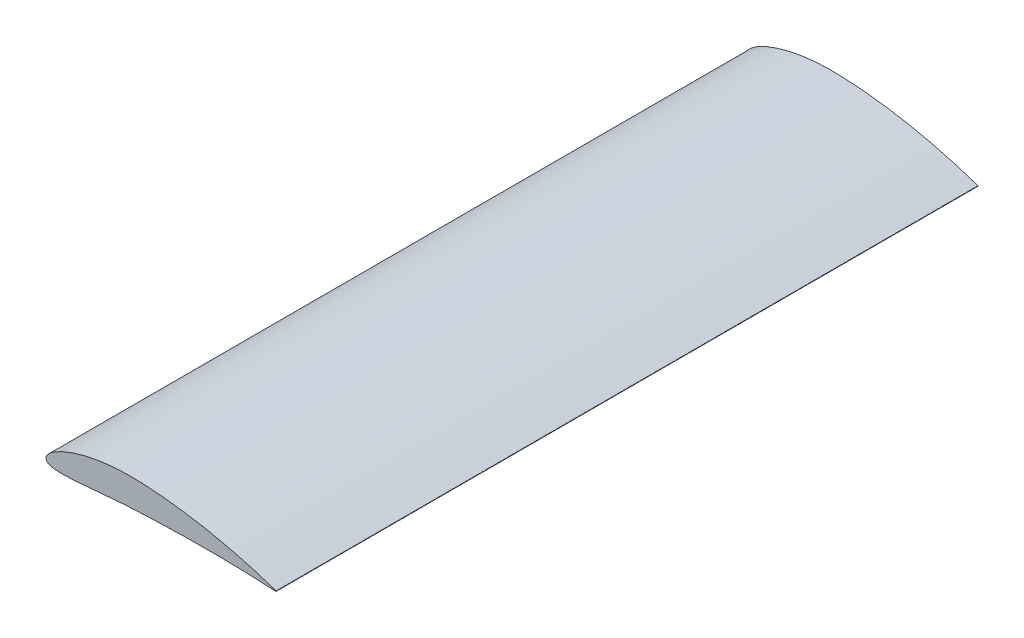
ISO-10303-21;
HEADER;
FILE_DESCRIPTION(('STEP AP214'),'2;1');
FILE_NAME('part.step','',(''),(''),'','','');
FILE_SCHEMA(('AUTOMOTIVE_DESIGN { 1 0 10303 214 1 1 1 1 }'));
ENDSEC;
DATA;
#1=APPLICATION_CONTEXT('core data for automotive mechanical design processes');
#2=APPLICATION_PROTOCOL_DEFINITION('international standard','automotive_design',2000,#1);
#3=PRODUCT_CONTEXT('',#1,'mechanical');
#4=PRODUCT('Part','Part','',(#3));
#5=PRODUCT_RELATED_PRODUCT_CATEGORY('part','',(#4));
#6=PRODUCT_DEFINITION_FORMATION('','',#4);
#7=PRODUCT_DEFINITION_CONTEXT('part definition',#1,'design');
#8=PRODUCT_DEFINITION('design','',#6,#7);
#9=PRODUCT_DEFINITION_SHAPE('','',#8);
#10=(LENGTH_UNIT() NAMED_UNIT(*) SI_UNIT(.MILLI.,.METRE.));
#11=(NAMED_UNIT(*) PLANE_ANGLE_UNIT() SI_UNIT($,.RADIAN.));
#12=(NAMED_UNIT(*) SI_UNIT($,.STERADIAN.) SOLID_ANGLE_UNIT());
#13=UNCERTAINTY_MEASURE_WITH_UNIT(LENGTH_MEASURE(1.E-05),#10,'distance_accuracy_value','');
#14=(GEOMETRIC_REPRESENTATION_CONTEXT(3) GLOBAL_UNCERTAINTY_ASSIGNED_CONTEXT((#13)) GLOBAL_UNIT_ASSIGNED_CONTEXT((#10,
#11,#12)) REPRESENTATION_CONTEXT('',''));
#15=CARTESIAN_POINT('',(0.,0.,0.));
#16=DIRECTION('',(0.,0.,1.));
#17=DIRECTION('',(1.,0.,0.));
#18=AXIS2_PLACEMENT_3D('',#15,#16,#17);
#19=CARTESIAN_POINT('',(400.,-56.1314604241552,610.));
#20=CARTESIAN_POINT('',(399.643918554306,-56.0100243892497,610.));
#21=CARTESIAN_POINT('',(398.225182446609,-55.5261865213148,610.));
#22=CARTESIAN_POINT('',(395.049408188706,-54.4412610846626,610.));
#23=CARTESIAN_POINT('',(389.783373865849,-52.6912902877293,610.));
#24=CARTESIAN_POINT('',(382.482718122838,-50.3092467823389,610.));
#25=CARTESIAN_POINT('',(373.20995949318,-47.3935870218292,610.));
#26=CARTESIAN_POINT('',(362.051946032247,-44.0358579057166,610.));
#27=CARTESIAN_POINT('',(349.118444869533,-40.3420425178444,610.));
#28=CARTESIAN_POINT('',(334.534016291896,-36.4292739847207,610.));
#29=CARTESIAN_POINT('',(318.445847384667,-32.4164875997235,610.));
#30=CARTESIAN_POINT('',(301.015870800138,-28.4316418465155,610.));
#31=CARTESIAN_POINT('',(282.430745597752,-24.5755442737041,610.));
#32=CARTESIAN_POINT('',(262.884756985944,-20.974334447521,610.));
#33=CARTESIAN_POINT('',(242.588909845362,-17.7350749285767,610.));
#34=CARTESIAN_POINT('',(221.766202388904,-14.9428293601724,610.));
#35=CARTESIAN_POINT('',(200.650785270376,-12.6886104485751,610.));
#36=CARTESIAN_POINT('',(179.469337758746,-11.0453447980687,610.));
#37=CARTESIAN_POINT('',(158.317419739384,-9.98879058200502,610.));
#38=CARTESIAN_POINT('',(137.422408652381,-9.92184078297386,610.));
#39=CARTESIAN_POINT('',(117.076822685352,-11.0062063522153,610.));
#40=CARTESIAN_POINT('',(97.7025756672614,-13.1385462010802,610.));
#41=CARTESIAN_POINT('',(79.5556671647519,-16.1957676331034,610.));
#42=CARTESIAN_POINT('',(62.8746232660483,-20.0461771052577,610.));
#43=CARTESIAN_POINT('',(47.8680976505703,-24.5036769361908,610.));
#44=CARTESIAN_POINT('',(34.7110447114062,-29.3700191903889,610.));
#45=CARTESIAN_POINT('',(23.544592010873,-34.4495343526392,610.));
#46=CARTESIAN_POINT('',(14.4740243328016,-39.5475050094727,610.));
#47=CARTESIAN_POINT('',(7.53911833084606,-44.484654540248,610.));
#48=CARTESIAN_POINT('',(2.77679390332445,-49.1540044189054,610.));
#49=CARTESIAN_POINT('',(0.0408785011586782,-53.5706365267323,610.));
#50=CARTESIAN_POINT('',(-0.194546817230398,-58.0079682198484,610.));
#51=CARTESIAN_POINT('',(2.44644908341802,-61.5541278861037,610.));
#52=CARTESIAN_POINT('',(7.06381671583535,-63.7654491289412,610.));
#53=CARTESIAN_POINT('',(13.4070985066364,-65.2069326628135,610.));
#54=CARTESIAN_POINT('',(21.5759533686981,-65.9473712076171,610.));
#55=CARTESIAN_POINT('',(31.4892585318981,-66.0697876651186,610.));
#56=CARTESIAN_POINT('',(43.0523238718758,-65.6389057265911,610.));
#57=CARTESIAN_POINT('',(56.1353015930865,-64.752489091053,610.));
#58=CARTESIAN_POINT('',(70.6041221469098,-63.5109889914793,610.));
#59=CARTESIAN_POINT('',(86.3184796834182,-62.0516048768765,610.));
#60=CARTESIAN_POINT('',(103.137102564271,-60.4953584349966,610.));
#61=CARTESIAN_POINT('',(120.914651969131,-58.9730905561407,610.));
#62=CARTESIAN_POINT('',(139.503910061892,-57.6216080664032,610.));
#63=CARTESIAN_POINT('',(158.899188374292,-56.5863970162045,610.));
#64=CARTESIAN_POINT('',(178.927680161598,-55.8354475247872,610.));
#65=CARTESIAN_POINT('',(199.378638327157,-55.0618803532254,610.));
#66=CARTESIAN_POINT('',(219.896731539223,-54.4308870331711,610.));
#67=CARTESIAN_POINT('',(240.253059313818,-53.9568109236802,610.));
#68=CARTESIAN_POINT('',(260.230575419891,-53.6642218198919,610.));
#69=CARTESIAN_POINT('',(279.609294350998,-53.5626974689925,610.));
#70=CARTESIAN_POINT('',(298.173165924277,-53.6409117870195,610.));
#71=CARTESIAN_POINT('',(315.712834064661,-53.8685717056236,610.));
#72=CARTESIAN_POINT('',(332.02597831082,-54.2376998087038,610.));
#73=CARTESIAN_POINT('',(346.921244916658,-54.6756757557696,610.));
#74=CARTESIAN_POINT('',(360.228403072193,-55.1751582104505,610.));
#75=CARTESIAN_POINT('',(371.761412466439,-55.6544442495398,610.));
#76=CARTESIAN_POINT('',(381.458692990959,-56.170812242102,610.));
#77=CARTESIAN_POINT('',(388.980801900753,-56.4119994138752,610.));
#78=CARTESIAN_POINT('',(394.775205353922,-57.066334594614,610.));
#79=CARTESIAN_POINT('',(397.644422256037,-56.6401553975498,610.));
#80=CARTESIAN_POINT('',(399.856156273963,-57.4460302393508,610.));
#81=CARTESIAN_POINT('',(399.890869460581,-56.821094559803,610.));
#82=CARTESIAN_POINT('',(399.901631596919,-56.627345623386,610.));
#83=B_SPLINE_CURVE_WITH_KNOTS('',3,(#19,#20,#21,#22,#23,#24,#25,#26,#27,#28,#29,#30,#31,#32,#33,
#34,#35,#36,#37,#38,#39,#40,#41,#42,#43,#44,#45,#46,#47,#48,#49,#50,#51,#52,#53,#54,#55,#56,#57,
#58,#59,#60,#61,#62,#63,#64,#65,#66,#67,#68,#69,#70,#71,#72,#73,#74,#75,#76,#77,#78,#79,#80,#81,
#82),.UNSPECIFIED.,.F.,.F.,(4,1,1,1,1,1,1,1,1,1,1,1,1,1,1,1,1,1,1,1,1,1,1,1,1,1,1,1,1,1,1,1,1,1,
1,1,1,1,1,1,1,1,1,1,1,1,1,1,1,1,1,1,1,1,1,1,1,1,1,1,1,4),(0.,0.0013715766250261,
0.00546477584250823,0.0122348018502247,0.0216019692657692,0.0334613445682541,0.0476712497544171,
0.0640813180473265,0.082496261138008,0.102719148689264,0.124527079157664,0.14767564836169,
0.171912572572513,0.196978379588112,0.222596912267761,0.248496766675201,0.274385100810321,
0.300041178316028,0.325689987882079,0.350525087532111,0.374279703233646,0.39671125377608,
0.41757673414408,0.436654005915541,0.45374438973928,0.468679993939526,0.481329415272233,
0.491630702034347,0.499615788540128,0.50554628117804,0.510184984462959,0.514824193684277,
0.520701508332397,0.528516039729706,0.538465751713385,0.55054260931231,0.564643256443601,
0.580638139182816,0.598344876375769,0.617584458372554,0.638174400803704,0.659922089978603,
0.682632113153432,0.706120665440723,0.730727382957721,0.755700243562022,0.780731768779878,
0.805564462972336,0.829932395841959,0.853570292180875,0.876213105152017,0.897609986535304,
0.917519393525195,0.93569834721614,0.951942678095032,0.966047158851578,0.977839939974046,
0.987174001699795,0.993931500880097,0.998018399437236,0.999385643972647,1.),.UNSPECIFIED.);
#84=DIRECTION('',(0.,0.,-1.));
#85=VECTOR('',#84,1.);
#86=SURFACE_OF_LINEAR_EXTRUSION('',#83,#85);
#87=CARTESIAN_POINT('',(400.,-56.1314604241552,-610.));
#88=CARTESIAN_POINT('',(399.643918554306,-56.0100243892497,-610.));
#89=CARTESIAN_POINT('',(398.225182446609,-55.5261865213148,-610.));
#90=CARTESIAN_POINT('',(395.049408188706,-54.4412610846626,-610.));
#91=CARTESIAN_POINT('',(389.783373865849,-52.6912902877293,-610.));
#92=CARTESIAN_POINT('',(382.482718122838,-50.3092467823389,-610.));
#93=CARTESIAN_POINT('',(373.20995949318,-47.3935870218292,-610.));
#94=CARTESIAN_POINT('',(362.051946032247,-44.0358579057166,-610.));
#95=CARTESIAN_POINT('',(349.118444869533,-40.3420425178444,-610.));
#96=CARTESIAN_POINT('',(334.534016291896,-36.4292739847207,-610.));
#97=CARTESIAN_POINT('',(318.445847384667,-32.4164875997235,-610.));
#98=CARTESIAN_POINT('',(301.015870800138,-28.4316418465155,-610.));
#99=CARTESIAN_POINT('',(282.430745597752,-24.5755442737041,-610.));
#100=CARTESIAN_POINT('',(262.884756985944,-20.974334447521,-610.));
#101=CARTESIAN_POINT('',(242.588909845362,-17.7350749285767,-610.));
#102=CARTESIAN_POINT('',(221.766202388904,-14.9428293601724,-610.));
#103=CARTESIAN_POINT('',(200.650785270376,-12.6886104485751,-610.));
#104=CARTESIAN_POINT('',(179.469337758746,-11.0453447980687,-610.));
#105=CARTESIAN_POINT('',(158.317419739384,-9.98879058200502,-610.));
#106=CARTESIAN_POINT('',(137.422408652381,-9.92184078297386,-610.));
#107=CARTESIAN_POINT('',(117.076822685352,-11.0062063522153,-610.));
#108=CARTESIAN_POINT('',(97.7025756672614,-13.1385462010802,-610.));
#109=CARTESIAN_POINT('',(79.5556671647519,-16.1957676331034,-610.));
#110=CARTESIAN_POINT('',(62.8746232660483,-20.0461771052577,-610.));
#111=CARTESIAN_POINT('',(47.8680976505703,-24.5036769361908,-610.));
#112=CARTESIAN_POINT('',(34.7110447114062,-29.3700191903889,-610.));
#113=CARTESIAN_POINT('',(23.544592010873,-34.4495343526392,-610.));
#114=CARTESIAN_POINT('',(14.4740243328016,-39.5475050094727,-610.));
#115=CARTESIAN_POINT('',(7.53911833084606,-44.484654540248,-610.));
#116=CARTESIAN_POINT('',(2.77679390332445,-49.1540044189054,-610.));
#117=CARTESIAN_POINT('',(0.0408785011586782,-53.5706365267323,-610.));
#118=CARTESIAN_POINT('',(-0.194546817230398,-58.0079682198484,-610.));
#119=CARTESIAN_POINT('',(2.44644908341802,-61.5541278861037,-610.));
#120=CARTESIAN_POINT('',(7.06381671583535,-63.7654491289412,-610.));
#121=CARTESIAN_POINT('',(13.4070985066364,-65.2069326628135,-610.));
#122=CARTESIAN_POINT('',(21.5759533686981,-65.9473712076171,-610.));
#123=CARTESIAN_POINT('',(31.4892585318981,-66.0697876651186,-610.));
#124=CARTESIAN_POINT('',(43.0523238718758,-65.6389057265911,-610.));
#125=CARTESIAN_POINT('',(56.1353015930865,-64.752489091053,-610.));
#126=CARTESIAN_POINT('',(70.6041221469098,-63.5109889914793,-610.));
#127=CARTESIAN_POINT('',(86.3184796834182,-62.0516048768765,-610.));
#128=CARTESIAN_POINT('',(103.137102564271,-60.4953584349966,-610.));
#129=CARTESIAN_POINT('',(120.914651969131,-58.9730905561407,-610.));
#130=CARTESIAN_POINT('',(139.503910061892,-57.6216080664032,-610.));
#131=CARTESIAN_POINT('',(158.899188374292,-56.5863970162045,-610.));
#132=CARTESIAN_POINT('',(178.927680161598,-55.8354475247872,-610.));
#133=CARTESIAN_POINT('',(199.378638327157,-55.0618803532254,-610.));
#134=CARTESIAN_POINT('',(219.896731539223,-54.4308870331711,-610.));
#135=CARTESIAN_POINT('',(240.253059313818,-53.9568109236802,-610.));
#136=CARTESIAN_POINT('',(260.230575419891,-53.6642218198919,-610.));
#137=CARTESIAN_POINT('',(279.609294350998,-53.5626974689925,-610.));
#138=CARTESIAN_POINT('',(298.173165924277,-53.6409117870195,-610.));
#139=CARTESIAN_POINT('',(315.712834064661,-53.8685717056236,-610.));
#140=CARTESIAN_POINT('',(332.02597831082,-54.2376998087038,-610.));
#141=CARTESIAN_POINT('',(346.921244916658,-54.6756757557696,-610.));
#142=CARTESIAN_POINT('',(360.228403072193,-55.1751582104505,-610.));
#143=CARTESIAN_POINT('',(371.761412466439,-55.6544442495398,-610.));
#144=CARTESIAN_POINT('',(381.458692990959,-56.170812242102,-610.));
#145=CARTESIAN_POINT('',(388.980801900753,-56.4119994138752,-610.));
#146=CARTESIAN_POINT('',(394.775205353922,-57.066334594614,-610.));
#147=CARTESIAN_POINT('',(397.644422256037,-56.6401553975498,-610.));
#148=CARTESIAN_POINT('',(399.856156273963,-57.4460302393508,-610.));
#149=CARTESIAN_POINT('',(399.890869460581,-56.821094559803,-610.));
#150=CARTESIAN_POINT('',(399.901631596919,-56.627345623386,-610.));
#151=B_SPLINE_CURVE_WITH_KNOTS('',3,(#87,#88,#89,#90,#91,#92,#93,#94,#95,#96,#97,#98,#99,#100,
#101,#102,#103,#104,#105,#106,#107,#108,#109,#110,#111,#112,#113,#114,#115,#116,#117,#118,#119,
#120,#121,#122,#123,#124,#125,#126,#127,#128,#129,#130,#131,#132,#133,#134,#135,#136,#137,#138,
#139,#140,#141,#142,#143,#144,#145,#146,#147,#148,#149,#150),.UNSPECIFIED.,.F.,.F.,(4,1,1,1,1,1,
1,1,1,1,1,1,1,1,1,1,1,1,1,1,1,1,1,1,1,1,1,1,1,1,1,1,1,1,1,1,1,1,1,1,1,1,1,1,1,1,1,1,1,1,1,1,1,1,
1,1,1,1,1,1,1,4),(0.,0.0013715766250261,0.00546477584250823,0.0122348018502247,
0.0216019692657692,0.0334613445682541,0.0476712497544171,0.0640813180473265,0.082496261138008,
0.102719148689264,0.124527079157664,0.14767564836169,0.171912572572513,0.196978379588112,
0.222596912267761,0.248496766675201,0.274385100810321,0.300041178316028,0.325689987882079,
0.350525087532111,0.374279703233646,0.39671125377608,0.41757673414408,0.436654005915541,
0.45374438973928,0.468679993939526,0.481329415272233,0.491630702034347,0.499615788540128,
0.50554628117804,0.510184984462959,0.514824193684277,0.520701508332397,0.528516039729706,
0.538465751713385,0.55054260931231,0.564643256443601,0.580638139182816,0.598344876375769,
0.617584458372554,0.638174400803704,0.659922089978603,0.682632113153432,0.706120665440723,
0.730727382957721,0.755700243562022,0.780731768779878,0.805564462972336,0.829932395841959,
0.853570292180875,0.876213105152017,0.897609986535304,0.917519393525195,0.93569834721614,
0.951942678095032,0.966047158851578,0.977839939974046,0.987174001699795,0.993931500880097,
0.998018399437236,0.999385643972647,1.),.UNSPECIFIED.);
#152=CARTESIAN_POINT('',(400.,-56.1314604241552,-610.));
#153=VERTEX_POINT('',#152);
#154=CARTESIAN_POINT('',(399.901631596919,-56.627345623386,-610.));
#155=VERTEX_POINT('',#154);
#156=EDGE_CURVE('E65',#153,#155,#151,.T.);
#157=ORIENTED_EDGE('',*,*,#156,.T.);
#158=DIRECTION('',(0.,0.,-1.));
#159=VECTOR('',#158,1.);
#160=CARTESIAN_POINT('',(399.901631596919,-56.627345623386,610.));
#161=LINE('',#160,#159);
#162=CARTESIAN_POINT('',(399.901631596919,-56.627345623386,610.));
#163=VERTEX_POINT('',#162);
#164=EDGE_CURVE('E11',#163,#155,#161,.T.);
#165=ORIENTED_EDGE('',*,*,#164,.F.);
#166=CARTESIAN_POINT('',(400.,-56.1314604241552,610.));
#167=VERTEX_POINT('',#166);
#168=EDGE_CURVE('E64',#167,#163,#83,.T.);
#169=ORIENTED_EDGE('',*,*,#168,.F.);
#170=DIRECTION('',(0.,0.,-1.));
#171=VECTOR('',#170,1.);
#172=CARTESIAN_POINT('',(400.,-56.1314604241552,610.));
#173=LINE('',#172,#171);
#174=EDGE_CURVE('E42',#167,#153,#173,.T.);
#175=ORIENTED_EDGE('',*,*,#174,.T.);
#176=EDGE_LOOP('',(#157,#165,#169,#175));
#177=FACE_BOUND('',#176,.T.);
#178=ADVANCED_FACE('F33',(#177),#86,.F.);
#179=CARTESIAN_POINT('',(399.901631596919,-56.627345623386,610.));
#180=DIRECTION('',(-0.98088707072058,0.194577887986276,0.));
#181=DIRECTION('',(-0.194577887986276,-0.98088707072058,0.));
#182=AXIS2_PLACEMENT_3D('',#179,#180,#181);
#183=PLANE('',#182);
#184=DIRECTION('',(0.194577887986276,0.98088707072058,0.));
#185=VECTOR('',#184,1.);
#186=CARTESIAN_POINT('',(399.901631596919,-56.627345623386,-610.));
#187=LINE('',#186,#185);
#188=EDGE_CURVE('E57',#155,#153,#187,.T.);
#189=ORIENTED_EDGE('',*,*,#188,.T.);
#190=ORIENTED_EDGE('',*,*,#174,.F.);
#191=DIRECTION('',(0.194577887986276,0.98088707072058,0.));
#192=VECTOR('',#191,1.);
#193=CARTESIAN_POINT('',(399.901631596919,-56.627345623386,610.));
#194=LINE('',#193,#192);
#195=EDGE_CURVE('E49',#163,#167,#194,.T.);
#196=ORIENTED_EDGE('',*,*,#195,.F.);
#197=ORIENTED_EDGE('',*,*,#164,.T.);
#198=EDGE_LOOP('',(#189,#190,#196,#197));
#199=FACE_BOUND('',#198,.T.);
#200=ADVANCED_FACE('F60',(#199),#183,.F.);
#201=CARTESIAN_POINT('',(2.40570309757762,-50.0109912833228,610.));
#202=DIRECTION('',(0.,0.,1.));
#203=DIRECTION('',(1.,0.,0.));
#204=AXIS2_PLACEMENT_3D('',#201,#202,#203);
#205=PLANE('',#204);
#206=ORIENTED_EDGE('',*,*,#168,.T.);
#207=ORIENTED_EDGE('',*,*,#195,.T.);
#208=EDGE_LOOP('',(#206,#207));
#209=FACE_BOUND('',#208,.T.);
#210=ADVANCED_FACE('F82',(#209),#205,.T.);
#211=CARTESIAN_POINT('',(2.40570309757762,-50.0109912833228,-610.));
#212=DIRECTION('',(0.,0.,1.));
#213=DIRECTION('',(1.,0.,0.));
#214=AXIS2_PLACEMENT_3D('',#211,#212,#213);
#215=PLANE('',#214);
#216=ORIENTED_EDGE('',*,*,#156,.F.);
#217=ORIENTED_EDGE('',*,*,#188,.F.);
#218=EDGE_LOOP('',(#216,#217));
#219=FACE_BOUND('',#218,.T.);
#220=ADVANCED_FACE('F68',(#219),#215,.F.);
#221=CLOSED_SHELL('',(#178,#200,#210,#220));
#222=MANIFOLD_SOLID_BREP('B2',#221);
#223=ADVANCED_BREP_SHAPE_REPRESENTATION('',(#18,#222),#14);
#224=SHAPE_DEFINITION_REPRESENTATION(#9,#223);
ENDSEC;
END-ISO-10303-21;
